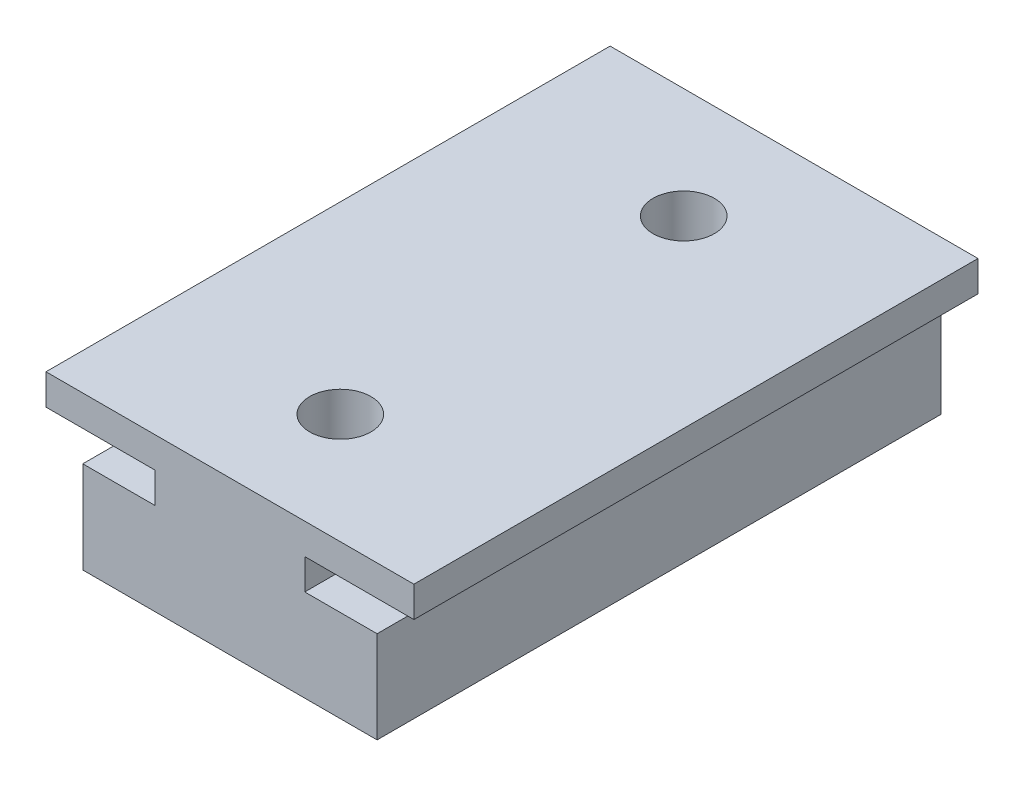
ISO-10303-21;
HEADER;
FILE_DESCRIPTION(('STEP AP214'),'2;1');
FILE_NAME('part.step','',(''),(''),'','','');
FILE_SCHEMA(('AUTOMOTIVE_DESIGN { 1 0 10303 214 1 1 1 1 }'));
ENDSEC;
DATA;
#1=APPLICATION_CONTEXT('core data for automotive mechanical design processes');
#2=APPLICATION_PROTOCOL_DEFINITION('international standard','automotive_design',2000,#1);
#3=PRODUCT_CONTEXT('',#1,'mechanical');
#4=PRODUCT('Part','Part','',(#3));
#5=PRODUCT_RELATED_PRODUCT_CATEGORY('part','',(#4));
#6=PRODUCT_DEFINITION_FORMATION('','',#4);
#7=PRODUCT_DEFINITION_CONTEXT('part definition',#1,'design');
#8=PRODUCT_DEFINITION('design','',#6,#7);
#9=PRODUCT_DEFINITION_SHAPE('','',#8);
#10=(LENGTH_UNIT() NAMED_UNIT(*) SI_UNIT(.MILLI.,.METRE.));
#11=(NAMED_UNIT(*) PLANE_ANGLE_UNIT() SI_UNIT($,.RADIAN.));
#12=(NAMED_UNIT(*) SI_UNIT($,.STERADIAN.) SOLID_ANGLE_UNIT());
#13=UNCERTAINTY_MEASURE_WITH_UNIT(LENGTH_MEASURE(1.E-05),#10,'distance_accuracy_value','');
#14=(GEOMETRIC_REPRESENTATION_CONTEXT(3) GLOBAL_UNCERTAINTY_ASSIGNED_CONTEXT((#13)) GLOBAL_UNIT_ASSIGNED_CONTEXT((#10,
#11,#12)) REPRESENTATION_CONTEXT('',''));
#15=CARTESIAN_POINT('',(0.,0.,0.));
#16=DIRECTION('',(0.,0.,1.));
#17=DIRECTION('',(1.,0.,0.));
#18=AXIS2_PLACEMENT_3D('',#15,#16,#17);
#19=CARTESIAN_POINT('',(15.,12.5,46.));
#20=DIRECTION('',(-1.,0.,0.));
#21=DIRECTION('',(0.,0.,1.));
#22=AXIS2_PLACEMENT_3D('',#19,#20,#21);
#23=PLANE('',#22);
#24=DIRECTION('',(0.,1.,0.));
#25=VECTOR('',#24,1.);
#26=CARTESIAN_POINT('',(15.,12.5,0.));
#27=LINE('',#26,#25);
#28=CARTESIAN_POINT('',(15.,10.,0.));
#29=VERTEX_POINT('',#28);
#30=CARTESIAN_POINT('',(15.,12.5,0.));
#31=VERTEX_POINT('',#30);
#32=EDGE_CURVE('E155',#29,#31,#27,.T.);
#33=ORIENTED_EDGE('',*,*,#32,.T.);
#34=DIRECTION('',(0.,0.,-1.));
#35=VECTOR('',#34,1.);
#36=CARTESIAN_POINT('',(15.,12.5,46.));
#37=LINE('',#36,#35);
#38=CARTESIAN_POINT('',(15.,12.5,46.));
#39=VERTEX_POINT('',#38);
#40=EDGE_CURVE('E11',#39,#31,#37,.T.);
#41=ORIENTED_EDGE('',*,*,#40,.F.);
#42=DIRECTION('',(0.,1.,0.));
#43=VECTOR('',#42,1.);
#44=CARTESIAN_POINT('',(15.,12.5,46.));
#45=LINE('',#44,#43);
#46=CARTESIAN_POINT('',(15.,10.,46.));
#47=VERTEX_POINT('',#46);
#48=EDGE_CURVE('E178',#47,#39,#45,.T.);
#49=ORIENTED_EDGE('',*,*,#48,.F.);
#50=DIRECTION('',(0.,0.,-1.));
#51=VECTOR('',#50,1.);
#52=CARTESIAN_POINT('',(15.,10.,46.));
#53=LINE('',#52,#51);
#54=EDGE_CURVE('E151',#47,#29,#53,.T.);
#55=ORIENTED_EDGE('',*,*,#54,.T.);
#56=EDGE_LOOP('',(#33,#41,#49,#55));
#57=FACE_BOUND('',#56,.T.);
#58=ADVANCED_FACE('F35',(#57),#23,.F.);
#59=CARTESIAN_POINT('',(-15.,12.5,46.));
#60=DIRECTION('',(0.,-1.,0.));
#61=DIRECTION('',(0.,0.,-1.));
#62=AXIS2_PLACEMENT_3D('',#59,#60,#61);
#63=PLANE('',#62);
#64=CARTESIAN_POINT('',(0.,12.5,37.));
#65=DIRECTION('',(0.,1.,0.));
#66=DIRECTION('',(0.,0.,1.));
#67=AXIS2_PLACEMENT_3D('',#64,#65,#66);
#68=CIRCLE('',#67,2.5);
#69=CARTESIAN_POINT('',(0.,12.5,39.5));
#70=VERTEX_POINT('',#69);
#71=EDGE_CURVE('E354',#70,#70,#68,.T.);
#72=ORIENTED_EDGE('',*,*,#71,.F.);
#73=EDGE_LOOP('',(#72));
#74=FACE_BOUND('',#73,.T.);
#75=CARTESIAN_POINT('',(0.,12.5,9.));
#76=DIRECTION('',(0.,1.,0.));
#77=DIRECTION('',(0.,0.,1.));
#78=AXIS2_PLACEMENT_3D('',#75,#76,#77);
#79=CIRCLE('',#78,2.5);
#80=CARTESIAN_POINT('',(0.,12.5,11.5));
#81=VERTEX_POINT('',#80);
#82=EDGE_CURVE('E356',#81,#81,#79,.T.);
#83=ORIENTED_EDGE('',*,*,#82,.F.);
#84=EDGE_LOOP('',(#83));
#85=FACE_BOUND('',#84,.T.);
#86=DIRECTION('',(-1.,0.,0.));
#87=VECTOR('',#86,1.);
#88=CARTESIAN_POINT('',(-15.,12.5,0.));
#89=LINE('',#88,#87);
#90=CARTESIAN_POINT('',(-15.,12.5,0.));
#91=VERTEX_POINT('',#90);
#92=EDGE_CURVE('E158',#31,#91,#89,.T.);
#93=ORIENTED_EDGE('',*,*,#92,.T.);
#94=DIRECTION('',(0.,0.,-1.));
#95=VECTOR('',#94,1.);
#96=CARTESIAN_POINT('',(-15.,12.5,46.));
#97=LINE('',#96,#95);
#98=CARTESIAN_POINT('',(-15.,12.5,46.));
#99=VERTEX_POINT('',#98);
#100=EDGE_CURVE('E43',#99,#91,#97,.T.);
#101=ORIENTED_EDGE('',*,*,#100,.F.);
#102=DIRECTION('',(-1.,0.,0.));
#103=VECTOR('',#102,1.);
#104=CARTESIAN_POINT('',(-15.,12.5,46.));
#105=LINE('',#104,#103);
#106=EDGE_CURVE('E106',#39,#99,#105,.T.);
#107=ORIENTED_EDGE('',*,*,#106,.F.);
#108=ORIENTED_EDGE('',*,*,#40,.T.);
#109=EDGE_LOOP('',(#93,#101,#107,#108));
#110=FACE_BOUND('',#109,.T.);
#111=ADVANCED_FACE('F256',(#74,#85,#110),#63,.F.);
#112=CARTESIAN_POINT('',(-15.,12.5,46.));
#113=DIRECTION('',(1.,0.,0.));
#114=DIRECTION('',(0.,0.,-1.));
#115=AXIS2_PLACEMENT_3D('',#112,#113,#114);
#116=PLANE('',#115);
#117=DIRECTION('',(0.,-1.,0.));
#118=VECTOR('',#117,1.);
#119=CARTESIAN_POINT('',(-15.,12.5,0.));
#120=LINE('',#119,#118);
#121=CARTESIAN_POINT('',(-15.,10.,0.));
#122=VERTEX_POINT('',#121);
#123=EDGE_CURVE('E161',#91,#122,#120,.T.);
#124=ORIENTED_EDGE('',*,*,#123,.T.);
#125=DIRECTION('',(0.,0.,-1.));
#126=VECTOR('',#125,1.);
#127=CARTESIAN_POINT('',(-15.,10.,46.));
#128=LINE('',#127,#126);
#129=CARTESIAN_POINT('',(-15.,10.,46.));
#130=VERTEX_POINT('',#129);
#131=EDGE_CURVE('E197',#130,#122,#128,.T.);
#132=ORIENTED_EDGE('',*,*,#131,.F.);
#133=DIRECTION('',(0.,-1.,0.));
#134=VECTOR('',#133,1.);
#135=CARTESIAN_POINT('',(-15.,12.5,46.));
#136=LINE('',#135,#134);
#137=EDGE_CURVE('E205',#99,#130,#136,.T.);
#138=ORIENTED_EDGE('',*,*,#137,.F.);
#139=ORIENTED_EDGE('',*,*,#100,.T.);
#140=EDGE_LOOP('',(#124,#132,#138,#139));
#141=FACE_BOUND('',#140,.T.);
#142=ADVANCED_FACE('F203',(#141),#116,.F.);
#143=CARTESIAN_POINT('',(-15.,10.,46.));
#144=DIRECTION('',(0.,1.,0.));
#145=DIRECTION('',(-1.,0.,0.));
#146=AXIS2_PLACEMENT_3D('',#143,#144,#145);
#147=PLANE('',#146);
#148=DIRECTION('',(1.,0.,0.));
#149=VECTOR('',#148,1.);
#150=CARTESIAN_POINT('',(-15.,10.,0.));
#151=LINE('',#150,#149);
#152=CARTESIAN_POINT('',(-6.1,10.,0.));
#153=VERTEX_POINT('',#152);
#154=EDGE_CURVE('E163',#122,#153,#151,.T.);
#155=ORIENTED_EDGE('',*,*,#154,.T.);
#156=DIRECTION('',(0.,0.,-1.));
#157=VECTOR('',#156,1.);
#158=CARTESIAN_POINT('',(-6.1,10.,46.));
#159=LINE('',#158,#157);
#160=CARTESIAN_POINT('',(-6.1,10.,46.));
#161=VERTEX_POINT('',#160);
#162=EDGE_CURVE('E194',#161,#153,#159,.T.);
#163=ORIENTED_EDGE('',*,*,#162,.F.);
#164=DIRECTION('',(1.,0.,0.));
#165=VECTOR('',#164,1.);
#166=CARTESIAN_POINT('',(-15.,10.,46.));
#167=LINE('',#166,#165);
#168=EDGE_CURVE('E223',#130,#161,#167,.T.);
#169=ORIENTED_EDGE('',*,*,#168,.F.);
#170=ORIENTED_EDGE('',*,*,#131,.T.);
#171=EDGE_LOOP('',(#155,#163,#169,#170));
#172=FACE_BOUND('',#171,.T.);
#173=ADVANCED_FACE('F214',(#172),#147,.F.);
#174=CARTESIAN_POINT('',(-6.1,10.,46.));
#175=DIRECTION('',(1.,0.,0.));
#176=DIRECTION('',(0.,1.,0.));
#177=AXIS2_PLACEMENT_3D('',#174,#175,#176);
#178=PLANE('',#177);
#179=DIRECTION('',(0.,-1.,0.));
#180=VECTOR('',#179,1.);
#181=CARTESIAN_POINT('',(-6.1,10.,0.));
#182=LINE('',#181,#180);
#183=CARTESIAN_POINT('',(-6.1,7.5,0.));
#184=VERTEX_POINT('',#183);
#185=EDGE_CURVE('E165',#153,#184,#182,.T.);
#186=ORIENTED_EDGE('',*,*,#185,.T.);
#187=DIRECTION('',(0.,0.,-1.));
#188=VECTOR('',#187,1.);
#189=CARTESIAN_POINT('',(-6.1,7.5,46.));
#190=LINE('',#189,#188);
#191=CARTESIAN_POINT('',(-6.1,7.5,46.));
#192=VERTEX_POINT('',#191);
#193=EDGE_CURVE('E191',#192,#184,#190,.T.);
#194=ORIENTED_EDGE('',*,*,#193,.F.);
#195=DIRECTION('',(0.,-1.,0.));
#196=VECTOR('',#195,1.);
#197=CARTESIAN_POINT('',(-6.1,10.,46.));
#198=LINE('',#197,#196);
#199=EDGE_CURVE('E220',#161,#192,#198,.T.);
#200=ORIENTED_EDGE('',*,*,#199,.F.);
#201=ORIENTED_EDGE('',*,*,#162,.T.);
#202=EDGE_LOOP('',(#186,#194,#200,#201));
#203=FACE_BOUND('',#202,.T.);
#204=ADVANCED_FACE('F218',(#203),#178,.F.);
#205=CARTESIAN_POINT('',(-6.1,7.5,46.));
#206=DIRECTION('',(0.,-1.,0.));
#207=DIRECTION('',(1.,0.,0.));
#208=AXIS2_PLACEMENT_3D('',#205,#206,#207);
#209=PLANE('',#208);
#210=DIRECTION('',(-1.,0.,0.));
#211=VECTOR('',#210,1.);
#212=CARTESIAN_POINT('',(-6.1,7.5,0.));
#213=LINE('',#212,#211);
#214=CARTESIAN_POINT('',(-12.,7.5,0.));
#215=VERTEX_POINT('',#214);
#216=EDGE_CURVE('E167',#184,#215,#213,.T.);
#217=ORIENTED_EDGE('',*,*,#216,.T.);
#218=DIRECTION('',(0.,0.,-1.));
#219=VECTOR('',#218,1.);
#220=CARTESIAN_POINT('',(-12.,7.5,46.));
#221=LINE('',#220,#219);
#222=CARTESIAN_POINT('',(-12.,7.5,46.));
#223=VERTEX_POINT('',#222);
#224=EDGE_CURVE('E188',#223,#215,#221,.T.);
#225=ORIENTED_EDGE('',*,*,#224,.F.);
#226=DIRECTION('',(-1.,0.,0.));
#227=VECTOR('',#226,1.);
#228=CARTESIAN_POINT('',(-6.1,7.5,46.));
#229=LINE('',#228,#227);
#230=EDGE_CURVE('E222',#192,#223,#229,.T.);
#231=ORIENTED_EDGE('',*,*,#230,.F.);
#232=ORIENTED_EDGE('',*,*,#193,.T.);
#233=EDGE_LOOP('',(#217,#225,#231,#232));
#234=FACE_BOUND('',#233,.T.);
#235=ADVANCED_FACE('F272',(#234),#209,.F.);
#236=CARTESIAN_POINT('',(-12.,7.5,46.));
#237=DIRECTION('',(1.,0.,0.));
#238=DIRECTION('',(0.,0.,-1.));
#239=AXIS2_PLACEMENT_3D('',#236,#237,#238);
#240=PLANE('',#239);
#241=DIRECTION('',(0.,-1.,0.));
#242=VECTOR('',#241,1.);
#243=CARTESIAN_POINT('',(-12.,7.5,0.));
#244=LINE('',#243,#242);
#245=CARTESIAN_POINT('',(-12.,0.,0.));
#246=VERTEX_POINT('',#245);
#247=EDGE_CURVE('E169',#215,#246,#244,.T.);
#248=ORIENTED_EDGE('',*,*,#247,.T.);
#249=DIRECTION('',(0.,0.,-1.));
#250=VECTOR('',#249,1.);
#251=CARTESIAN_POINT('',(-12.,0.,46.));
#252=LINE('',#251,#250);
#253=CARTESIAN_POINT('',(-12.,0.,46.));
#254=VERTEX_POINT('',#253);
#255=EDGE_CURVE('E185',#254,#246,#252,.T.);
#256=ORIENTED_EDGE('',*,*,#255,.F.);
#257=DIRECTION('',(0.,-1.,0.));
#258=VECTOR('',#257,1.);
#259=CARTESIAN_POINT('',(-12.,7.5,46.));
#260=LINE('',#259,#258);
#261=EDGE_CURVE('E225',#223,#254,#260,.T.);
#262=ORIENTED_EDGE('',*,*,#261,.F.);
#263=ORIENTED_EDGE('',*,*,#224,.T.);
#264=EDGE_LOOP('',(#248,#256,#262,#263));
#265=FACE_BOUND('',#264,.T.);
#266=ADVANCED_FACE('F275',(#265),#240,.F.);
#267=CARTESIAN_POINT('',(12.,0.,46.));
#268=DIRECTION('',(0.,1.,0.));
#269=DIRECTION('',(0.,0.,1.));
#270=AXIS2_PLACEMENT_3D('',#267,#268,#269);
#271=PLANE('',#270);
#272=CARTESIAN_POINT('',(0.,0.,37.));
#273=DIRECTION('',(0.,1.,0.));
#274=DIRECTION('',(0.,0.,1.));
#275=AXIS2_PLACEMENT_3D('',#272,#273,#274);
#276=CIRCLE('',#275,2.5);
#277=CARTESIAN_POINT('',(0.,0.,39.5));
#278=VERTEX_POINT('',#277);
#279=EDGE_CURVE('E352',#278,#278,#276,.T.);
#280=ORIENTED_EDGE('',*,*,#279,.T.);
#281=EDGE_LOOP('',(#280));
#282=FACE_BOUND('',#281,.T.);
#283=CARTESIAN_POINT('',(0.,0.,9.));
#284=DIRECTION('',(0.,1.,0.));
#285=DIRECTION('',(0.,0.,1.));
#286=AXIS2_PLACEMENT_3D('',#283,#284,#285);
#287=CIRCLE('',#286,2.5);
#288=CARTESIAN_POINT('',(0.,0.,11.5));
#289=VERTEX_POINT('',#288);
#290=EDGE_CURVE('E159',#289,#289,#287,.T.);
#291=ORIENTED_EDGE('',*,*,#290,.T.);
#292=EDGE_LOOP('',(#291));
#293=FACE_BOUND('',#292,.T.);
#294=DIRECTION('',(1.,0.,0.));
#295=VECTOR('',#294,1.);
#296=CARTESIAN_POINT('',(12.,0.,0.));
#297=LINE('',#296,#295);
#298=CARTESIAN_POINT('',(12.,0.,0.));
#299=VERTEX_POINT('',#298);
#300=EDGE_CURVE('E171',#246,#299,#297,.T.);
#301=ORIENTED_EDGE('',*,*,#300,.T.);
#302=DIRECTION('',(0.,0.,-1.));
#303=VECTOR('',#302,1.);
#304=CARTESIAN_POINT('',(12.,0.,46.));
#305=LINE('',#304,#303);
#306=CARTESIAN_POINT('',(12.,0.,46.));
#307=VERTEX_POINT('',#306);
#308=EDGE_CURVE('E182',#307,#299,#305,.T.);
#309=ORIENTED_EDGE('',*,*,#308,.F.);
#310=DIRECTION('',(1.,0.,0.));
#311=VECTOR('',#310,1.);
#312=CARTESIAN_POINT('',(12.,0.,46.));
#313=LINE('',#312,#311);
#314=EDGE_CURVE('E231',#254,#307,#313,.T.);
#315=ORIENTED_EDGE('',*,*,#314,.F.);
#316=ORIENTED_EDGE('',*,*,#255,.T.);
#317=EDGE_LOOP('',(#301,#309,#315,#316));
#318=FACE_BOUND('',#317,.T.);
#319=ADVANCED_FACE('F237',(#282,#293,#318),#271,.F.);
#320=CARTESIAN_POINT('',(12.,7.5,46.));
#321=DIRECTION('',(-1.,0.,0.));
#322=DIRECTION('',(0.,0.,1.));
#323=AXIS2_PLACEMENT_3D('',#320,#321,#322);
#324=PLANE('',#323);
#325=DIRECTION('',(0.,1.,0.));
#326=VECTOR('',#325,1.);
#327=CARTESIAN_POINT('',(12.,7.5,0.));
#328=LINE('',#327,#326);
#329=CARTESIAN_POINT('',(12.,7.5,0.));
#330=VERTEX_POINT('',#329);
#331=EDGE_CURVE('E173',#299,#330,#328,.T.);
#332=ORIENTED_EDGE('',*,*,#331,.T.);
#333=DIRECTION('',(0.,0.,-1.));
#334=VECTOR('',#333,1.);
#335=CARTESIAN_POINT('',(12.,7.5,46.));
#336=LINE('',#335,#334);
#337=CARTESIAN_POINT('',(12.,7.5,46.));
#338=VERTEX_POINT('',#337);
#339=EDGE_CURVE('E146',#338,#330,#336,.T.);
#340=ORIENTED_EDGE('',*,*,#339,.F.);
#341=DIRECTION('',(0.,1.,0.));
#342=VECTOR('',#341,1.);
#343=CARTESIAN_POINT('',(12.,7.5,46.));
#344=LINE('',#343,#342);
#345=EDGE_CURVE('E137',#307,#338,#344,.T.);
#346=ORIENTED_EDGE('',*,*,#345,.F.);
#347=ORIENTED_EDGE('',*,*,#308,.T.);
#348=EDGE_LOOP('',(#332,#340,#346,#347));
#349=FACE_BOUND('',#348,.T.);
#350=ADVANCED_FACE('F241',(#349),#324,.F.);
#351=CARTESIAN_POINT('',(6.1,7.5,46.));
#352=DIRECTION('',(0.,-1.,0.));
#353=DIRECTION('',(1.,0.,0.));
#354=AXIS2_PLACEMENT_3D('',#351,#352,#353);
#355=PLANE('',#354);
#356=DIRECTION('',(-1.,0.,0.));
#357=VECTOR('',#356,1.);
#358=CARTESIAN_POINT('',(6.1,7.5,0.));
#359=LINE('',#358,#357);
#360=CARTESIAN_POINT('',(6.1,7.5,0.));
#361=VERTEX_POINT('',#360);
#362=EDGE_CURVE('E145',#330,#361,#359,.T.);
#363=ORIENTED_EDGE('',*,*,#362,.T.);
#364=DIRECTION('',(0.,0.,-1.));
#365=VECTOR('',#364,1.);
#366=CARTESIAN_POINT('',(6.1,7.5,46.));
#367=LINE('',#366,#365);
#368=CARTESIAN_POINT('',(6.1,7.5,46.));
#369=VERTEX_POINT('',#368);
#370=EDGE_CURVE('E142',#369,#361,#367,.T.);
#371=ORIENTED_EDGE('',*,*,#370,.F.);
#372=DIRECTION('',(-1.,0.,0.));
#373=VECTOR('',#372,1.);
#374=CARTESIAN_POINT('',(6.1,7.5,46.));
#375=LINE('',#374,#373);
#376=EDGE_CURVE('E131',#338,#369,#375,.T.);
#377=ORIENTED_EDGE('',*,*,#376,.F.);
#378=ORIENTED_EDGE('',*,*,#339,.T.);
#379=EDGE_LOOP('',(#363,#371,#377,#378));
#380=FACE_BOUND('',#379,.T.);
#381=ADVANCED_FACE('F143',(#380),#355,.F.);
#382=CARTESIAN_POINT('',(6.1,10.,46.));
#383=DIRECTION('',(-1.,0.,0.));
#384=DIRECTION('',(0.,-1.,0.));
#385=AXIS2_PLACEMENT_3D('',#382,#383,#384);
#386=PLANE('',#385);
#387=DIRECTION('',(0.,1.,0.));
#388=VECTOR('',#387,1.);
#389=CARTESIAN_POINT('',(6.1,10.,0.));
#390=LINE('',#389,#388);
#391=CARTESIAN_POINT('',(6.1,10.,0.));
#392=VERTEX_POINT('',#391);
#393=EDGE_CURVE('E92',#361,#392,#390,.T.);
#394=ORIENTED_EDGE('',*,*,#393,.T.);
#395=DIRECTION('',(0.,0.,-1.));
#396=VECTOR('',#395,1.);
#397=CARTESIAN_POINT('',(6.1,10.,46.));
#398=LINE('',#397,#396);
#399=CARTESIAN_POINT('',(6.1,10.,46.));
#400=VERTEX_POINT('',#399);
#401=EDGE_CURVE('E147',#400,#392,#398,.T.);
#402=ORIENTED_EDGE('',*,*,#401,.F.);
#403=DIRECTION('',(0.,1.,0.));
#404=VECTOR('',#403,1.);
#405=CARTESIAN_POINT('',(6.1,10.,46.));
#406=LINE('',#405,#404);
#407=EDGE_CURVE('E135',#369,#400,#406,.T.);
#408=ORIENTED_EDGE('',*,*,#407,.F.);
#409=ORIENTED_EDGE('',*,*,#370,.T.);
#410=EDGE_LOOP('',(#394,#402,#408,#409));
#411=FACE_BOUND('',#410,.T.);
#412=ADVANCED_FACE('F149',(#411),#386,.F.);
#413=CARTESIAN_POINT('',(15.,10.,46.));
#414=DIRECTION('',(0.,1.,0.));
#415=DIRECTION('',(-1.,0.,0.));
#416=AXIS2_PLACEMENT_3D('',#413,#414,#415);
#417=PLANE('',#416);
#418=DIRECTION('',(1.,0.,0.));
#419=VECTOR('',#418,1.);
#420=CARTESIAN_POINT('',(15.,10.,0.));
#421=LINE('',#420,#419);
#422=EDGE_CURVE('E98',#392,#29,#421,.T.);
#423=ORIENTED_EDGE('',*,*,#422,.T.);
#424=ORIENTED_EDGE('',*,*,#54,.F.);
#425=DIRECTION('',(1.,0.,0.));
#426=VECTOR('',#425,1.);
#427=CARTESIAN_POINT('',(15.,10.,46.));
#428=LINE('',#427,#426);
#429=EDGE_CURVE('E51',#400,#47,#428,.T.);
#430=ORIENTED_EDGE('',*,*,#429,.F.);
#431=ORIENTED_EDGE('',*,*,#401,.T.);
#432=EDGE_LOOP('',(#423,#424,#430,#431));
#433=FACE_BOUND('',#432,.T.);
#434=ADVANCED_FACE('F245',(#433),#417,.F.);
#435=CARTESIAN_POINT('',(0.,0.,46.));
#436=DIRECTION('',(0.,0.,-1.));
#437=DIRECTION('',(-1.,0.,0.));
#438=AXIS2_PLACEMENT_3D('',#435,#436,#437);
#439=PLANE('',#438);
#440=ORIENTED_EDGE('',*,*,#48,.T.);
#441=ORIENTED_EDGE('',*,*,#106,.T.);
#442=ORIENTED_EDGE('',*,*,#137,.T.);
#443=ORIENTED_EDGE('',*,*,#168,.T.);
#444=ORIENTED_EDGE('',*,*,#199,.T.);
#445=ORIENTED_EDGE('',*,*,#230,.T.);
#446=ORIENTED_EDGE('',*,*,#261,.T.);
#447=ORIENTED_EDGE('',*,*,#314,.T.);
#448=ORIENTED_EDGE('',*,*,#345,.T.);
#449=ORIENTED_EDGE('',*,*,#376,.T.);
#450=ORIENTED_EDGE('',*,*,#407,.T.);
#451=ORIENTED_EDGE('',*,*,#429,.T.);
#452=EDGE_LOOP('',(#440,#441,#442,#443,#444,#445,#446,#447,#448,#449,#450,#451));
#453=FACE_BOUND('',#452,.T.);
#454=ADVANCED_FACE('F133',(#453),#439,.F.);
#455=CARTESIAN_POINT('',(0.,0.,0.));
#456=DIRECTION('',(0.,0.,-1.));
#457=DIRECTION('',(-1.,0.,0.));
#458=AXIS2_PLACEMENT_3D('',#455,#456,#457);
#459=PLANE('',#458);
#460=ORIENTED_EDGE('',*,*,#32,.F.);
#461=ORIENTED_EDGE('',*,*,#422,.F.);
#462=ORIENTED_EDGE('',*,*,#393,.F.);
#463=ORIENTED_EDGE('',*,*,#362,.F.);
#464=ORIENTED_EDGE('',*,*,#331,.F.);
#465=ORIENTED_EDGE('',*,*,#300,.F.);
#466=ORIENTED_EDGE('',*,*,#247,.F.);
#467=ORIENTED_EDGE('',*,*,#216,.F.);
#468=ORIENTED_EDGE('',*,*,#185,.F.);
#469=ORIENTED_EDGE('',*,*,#154,.F.);
#470=ORIENTED_EDGE('',*,*,#123,.F.);
#471=ORIENTED_EDGE('',*,*,#92,.F.);
#472=EDGE_LOOP('',(#460,#461,#462,#463,#464,#465,#466,#467,#468,#469,#470,#471));
#473=FACE_BOUND('',#472,.T.);
#474=ADVANCED_FACE('F209',(#473),#459,.T.);
#475=CARTESIAN_POINT('',(0.,0.,9.));
#476=DIRECTION('',(0.,1.,0.));
#477=DIRECTION('',(0.,0.,1.));
#478=AXIS2_PLACEMENT_3D('',#475,#476,#477);
#479=CYLINDRICAL_SURFACE('',#478,2.5);
#480=ORIENTED_EDGE('',*,*,#290,.F.);
#481=EDGE_LOOP('',(#480));
#482=FACE_BOUND('',#481,.T.);
#483=ORIENTED_EDGE('',*,*,#82,.T.);
#484=EDGE_LOOP('',(#483));
#485=FACE_BOUND('',#484,.T.);
#486=ADVANCED_FACE('F312',(#482,#485),#479,.F.);
#487=CARTESIAN_POINT('',(0.,0.,37.));
#488=DIRECTION('',(0.,1.,0.));
#489=DIRECTION('',(0.,0.,1.));
#490=AXIS2_PLACEMENT_3D('',#487,#488,#489);
#491=CYLINDRICAL_SURFACE('',#490,2.5);
#492=ORIENTED_EDGE('',*,*,#279,.F.);
#493=EDGE_LOOP('',(#492));
#494=FACE_BOUND('',#493,.T.);
#495=ORIENTED_EDGE('',*,*,#71,.T.);
#496=EDGE_LOOP('',(#495));
#497=FACE_BOUND('',#496,.T.);
#498=ADVANCED_FACE('F335',(#494,#497),#491,.F.);
#499=CLOSED_SHELL('',(#58,#111,#142,#173,#204,#235,#266,#319,#350,#381,#412,#434,#454,#474,#486,#498));
#500=MANIFOLD_SOLID_BREP('B2',#499);
#501=ADVANCED_BREP_SHAPE_REPRESENTATION('',(#18,#500),#14);
#502=SHAPE_DEFINITION_REPRESENTATION(#9,#501);
ENDSEC;
END-ISO-10303-21;
